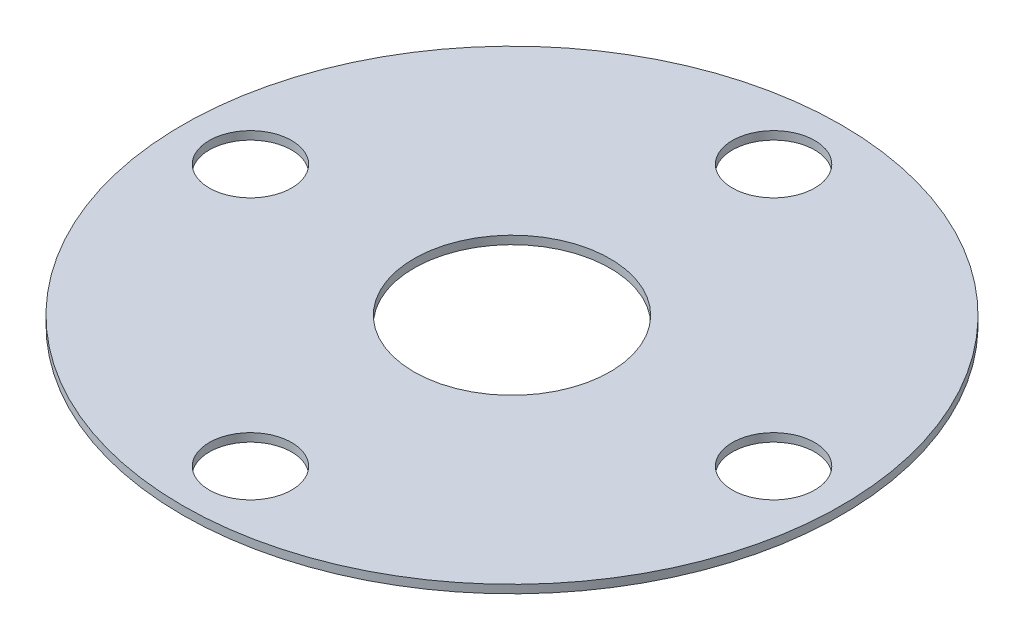
ISO-10303-21;
HEADER;
FILE_DESCRIPTION(('STEP AP214'),'2;1');
FILE_NAME('part.step','',(''),(''),'','','');
FILE_SCHEMA(('AUTOMOTIVE_DESIGN { 1 0 10303 214 1 1 1 1 }'));
ENDSEC;
DATA;
#1=APPLICATION_CONTEXT('core data for automotive mechanical design processes');
#2=APPLICATION_PROTOCOL_DEFINITION('international standard','automotive_design',2000,#1);
#3=PRODUCT_CONTEXT('',#1,'mechanical');
#4=PRODUCT('Part','Part','',(#3));
#5=PRODUCT_RELATED_PRODUCT_CATEGORY('part','',(#4));
#6=PRODUCT_DEFINITION_FORMATION('','',#4);
#7=PRODUCT_DEFINITION_CONTEXT('part definition',#1,'design');
#8=PRODUCT_DEFINITION('design','',#6,#7);
#9=PRODUCT_DEFINITION_SHAPE('','',#8);
#10=(LENGTH_UNIT() NAMED_UNIT(*) SI_UNIT(.MILLI.,.METRE.));
#11=(NAMED_UNIT(*) PLANE_ANGLE_UNIT() SI_UNIT($,.RADIAN.));
#12=(NAMED_UNIT(*) SI_UNIT($,.STERADIAN.) SOLID_ANGLE_UNIT());
#13=UNCERTAINTY_MEASURE_WITH_UNIT(LENGTH_MEASURE(1.E-05),#10,'distance_accuracy_value','');
#14=(GEOMETRIC_REPRESENTATION_CONTEXT(3) GLOBAL_UNCERTAINTY_ASSIGNED_CONTEXT((#13)) GLOBAL_UNIT_ASSIGNED_CONTEXT((#10,
#11,#12)) REPRESENTATION_CONTEXT('',''));
#15=CARTESIAN_POINT('',(0.,0.,0.));
#16=DIRECTION('',(0.,0.,1.));
#17=DIRECTION('',(1.,0.,0.));
#18=AXIS2_PLACEMENT_3D('',#15,#16,#17);
#19=CARTESIAN_POINT('',(0.,0.8,0.));
#20=DIRECTION('',(0.,1.,0.));
#21=DIRECTION('',(0.,0.,1.));
#22=AXIS2_PLACEMENT_3D('',#19,#20,#21);
#23=PLANE('',#22);
#24=CARTESIAN_POINT('',(3.36536354339501E-13,0.8,25.4000000000014));
#25=DIRECTION('',(0.,1.,0.));
#26=DIRECTION('',(0.,0.,1.));
#27=AXIS2_PLACEMENT_3D('',#24,#25,#26);
#28=CIRCLE('',#27,4.);
#29=CARTESIAN_POINT('',(3.36536354339501E-13,0.8,29.4000000000014));
#30=VERTEX_POINT('',#29);
#31=EDGE_CURVE('E72',#30,#30,#28,.T.);
#32=ORIENTED_EDGE('',*,*,#31,.F.);
#33=EDGE_LOOP('',(#32));
#34=FACE_BOUND('',#33,.T.);
#35=CARTESIAN_POINT('',(0.,0.8,-25.4));
#36=DIRECTION('',(0.,1.,0.));
#37=DIRECTION('',(0.,0.,1.));
#38=AXIS2_PLACEMENT_3D('',#35,#36,#37);
#39=CIRCLE('',#38,4.);
#40=CARTESIAN_POINT('',(0.,0.8,-21.4));
#41=VERTEX_POINT('',#40);
#42=EDGE_CURVE('E56',#41,#41,#39,.T.);
#43=ORIENTED_EDGE('',*,*,#42,.F.);
#44=EDGE_LOOP('',(#43));
#45=FACE_BOUND('',#44,.T.);
#46=CARTESIAN_POINT('',(0.,0.8,0.));
#47=DIRECTION('',(0.,1.,0.));
#48=DIRECTION('',(0.,0.,1.));
#49=AXIS2_PLACEMENT_3D('',#46,#47,#48);
#50=CIRCLE('',#49,32.004);
#51=CARTESIAN_POINT('',(0.,0.8,32.004));
#52=VERTEX_POINT('',#51);
#53=EDGE_CURVE('E10',#52,#52,#50,.T.);
#54=ORIENTED_EDGE('',*,*,#53,.T.);
#55=EDGE_LOOP('',(#54));
#56=FACE_BOUND('',#55,.T.);
#57=CARTESIAN_POINT('',(0.,0.8,0.));
#58=DIRECTION('',(0.,1.,0.));
#59=DIRECTION('',(0.,0.,1.));
#60=AXIS2_PLACEMENT_3D('',#57,#58,#59);
#61=CIRCLE('',#60,9.525);
#62=CARTESIAN_POINT('',(0.,0.8,9.525));
#63=VERTEX_POINT('',#62);
#64=EDGE_CURVE('E50',#63,#63,#61,.T.);
#65=ORIENTED_EDGE('',*,*,#64,.F.);
#66=EDGE_LOOP('',(#65));
#67=FACE_BOUND('',#66,.T.);
#68=CARTESIAN_POINT('',(25.4000000000008,0.8,5.13478148889135E-13));
#69=DIRECTION('',(0.,1.,0.));
#70=DIRECTION('',(0.,0.,1.));
#71=AXIS2_PLACEMENT_3D('',#68,#69,#70);
#72=CIRCLE('',#71,4.);
#73=CARTESIAN_POINT('',(25.4000000000008,0.8,4.00000000000051));
#74=VERTEX_POINT('',#73);
#75=EDGE_CURVE('E64',#74,#74,#72,.T.);
#76=ORIENTED_EDGE('',*,*,#75,.F.);
#77=EDGE_LOOP('',(#76));
#78=FACE_BOUND('',#77,.T.);
#79=CARTESIAN_POINT('',(-25.4000000000005,0.8,8.50014503228635E-13));
#80=DIRECTION('',(0.,1.,0.));
#81=DIRECTION('',(0.,0.,1.));
#82=AXIS2_PLACEMENT_3D('',#79,#80,#81);
#83=CIRCLE('',#82,4.);
#84=CARTESIAN_POINT('',(-25.4000000000005,0.8,4.00000000000085));
#85=VERTEX_POINT('',#84);
#86=EDGE_CURVE('E80',#85,#85,#83,.T.);
#87=ORIENTED_EDGE('',*,*,#86,.F.);
#88=EDGE_LOOP('',(#87));
#89=FACE_BOUND('',#88,.T.);
#90=ADVANCED_FACE('F37',(#34,#45,#56,#67,#78,#89),#23,.T.);
#91=CARTESIAN_POINT('',(0.,0.,0.));
#92=DIRECTION('',(0.,1.,0.));
#93=DIRECTION('',(0.,0.,1.));
#94=AXIS2_PLACEMENT_3D('',#91,#92,#93);
#95=PLANE('',#94);
#96=CARTESIAN_POINT('',(0.,0.,0.));
#97=DIRECTION('',(0.,1.,0.));
#98=DIRECTION('',(0.,0.,1.));
#99=AXIS2_PLACEMENT_3D('',#96,#97,#98);
#100=CIRCLE('',#99,32.004);
#101=CARTESIAN_POINT('',(0.,0.,32.004));
#102=VERTEX_POINT('',#101);
#103=EDGE_CURVE('E41',#102,#102,#100,.T.);
#104=ORIENTED_EDGE('',*,*,#103,.F.);
#105=EDGE_LOOP('',(#104));
#106=FACE_BOUND('',#105,.T.);
#107=CARTESIAN_POINT('',(0.,0.,0.));
#108=DIRECTION('',(0.,1.,0.));
#109=DIRECTION('',(0.,0.,1.));
#110=AXIS2_PLACEMENT_3D('',#107,#108,#109);
#111=CIRCLE('',#110,9.525);
#112=CARTESIAN_POINT('',(0.,0.,9.525));
#113=VERTEX_POINT('',#112);
#114=EDGE_CURVE('E52',#113,#113,#111,.T.);
#115=ORIENTED_EDGE('',*,*,#114,.T.);
#116=EDGE_LOOP('',(#115));
#117=FACE_BOUND('',#116,.T.);
#118=CARTESIAN_POINT('',(0.,0.,-25.4));
#119=DIRECTION('',(0.,1.,0.));
#120=DIRECTION('',(0.,0.,1.));
#121=AXIS2_PLACEMENT_3D('',#118,#119,#120);
#122=CIRCLE('',#121,4.);
#123=CARTESIAN_POINT('',(0.,0.,-21.4));
#124=VERTEX_POINT('',#123);
#125=EDGE_CURVE('E60',#124,#124,#122,.T.);
#126=ORIENTED_EDGE('',*,*,#125,.T.);
#127=EDGE_LOOP('',(#126));
#128=FACE_BOUND('',#127,.T.);
#129=CARTESIAN_POINT('',(25.4000000000008,0.,5.13478148889135E-13));
#130=DIRECTION('',(0.,1.,0.));
#131=DIRECTION('',(0.,0.,1.));
#132=AXIS2_PLACEMENT_3D('',#129,#130,#131);
#133=CIRCLE('',#132,4.);
#134=CARTESIAN_POINT('',(25.4000000000008,0.,4.00000000000051));
#135=VERTEX_POINT('',#134);
#136=EDGE_CURVE('E68',#135,#135,#133,.T.);
#137=ORIENTED_EDGE('',*,*,#136,.T.);
#138=EDGE_LOOP('',(#137));
#139=FACE_BOUND('',#138,.T.);
#140=CARTESIAN_POINT('',(3.36536354339501E-13,0.,25.4000000000014));
#141=DIRECTION('',(0.,1.,0.));
#142=DIRECTION('',(0.,0.,1.));
#143=AXIS2_PLACEMENT_3D('',#140,#141,#142);
#144=CIRCLE('',#143,4.);
#145=CARTESIAN_POINT('',(3.36536354339501E-13,0.,29.4000000000014));
#146=VERTEX_POINT('',#145);
#147=EDGE_CURVE('E76',#146,#146,#144,.T.);
#148=ORIENTED_EDGE('',*,*,#147,.T.);
#149=EDGE_LOOP('',(#148));
#150=FACE_BOUND('',#149,.T.);
#151=CARTESIAN_POINT('',(-25.4000000000005,0.,8.50014503228635E-13));
#152=DIRECTION('',(0.,1.,0.));
#153=DIRECTION('',(0.,0.,1.));
#154=AXIS2_PLACEMENT_3D('',#151,#152,#153);
#155=CIRCLE('',#154,4.);
#156=CARTESIAN_POINT('',(-25.4000000000005,0.,4.00000000000085));
#157=VERTEX_POINT('',#156);
#158=EDGE_CURVE('E84',#157,#157,#155,.T.);
#159=ORIENTED_EDGE('',*,*,#158,.T.);
#160=EDGE_LOOP('',(#159));
#161=FACE_BOUND('',#160,.T.);
#162=ADVANCED_FACE('F96',(#106,#117,#128,#139,#150,#161),#95,.F.);
#163=CARTESIAN_POINT('',(0.,0.8,0.));
#164=DIRECTION('',(0.,-1.,0.));
#165=DIRECTION('',(0.,0.,-1.));
#166=AXIS2_PLACEMENT_3D('',#163,#164,#165);
#167=CYLINDRICAL_SURFACE('',#166,32.004);
#168=ORIENTED_EDGE('',*,*,#53,.F.);
#169=EDGE_LOOP('',(#168));
#170=FACE_BOUND('',#169,.T.);
#171=ORIENTED_EDGE('',*,*,#103,.T.);
#172=EDGE_LOOP('',(#171));
#173=FACE_BOUND('',#172,.T.);
#174=ADVANCED_FACE('F39',(#170,#173),#167,.T.);
#175=CARTESIAN_POINT('',(0.,0.8,0.));
#176=DIRECTION('',(0.,-1.,0.));
#177=DIRECTION('',(0.,0.,-1.));
#178=AXIS2_PLACEMENT_3D('',#175,#176,#177);
#179=CYLINDRICAL_SURFACE('',#178,9.525);
#180=ORIENTED_EDGE('',*,*,#64,.T.);
#181=EDGE_LOOP('',(#180));
#182=FACE_BOUND('',#181,.T.);
#183=ORIENTED_EDGE('',*,*,#114,.F.);
#184=EDGE_LOOP('',(#183));
#185=FACE_BOUND('',#184,.T.);
#186=ADVANCED_FACE('F106',(#182,#185),#179,.F.);
#187=CARTESIAN_POINT('',(0.,0.8,-25.4));
#188=DIRECTION('',(0.,-1.,0.));
#189=DIRECTION('',(0.,0.,-1.));
#190=AXIS2_PLACEMENT_3D('',#187,#188,#189);
#191=CYLINDRICAL_SURFACE('',#190,4.);
#192=ORIENTED_EDGE('',*,*,#42,.T.);
#193=EDGE_LOOP('',(#192));
#194=FACE_BOUND('',#193,.T.);
#195=ORIENTED_EDGE('',*,*,#125,.F.);
#196=EDGE_LOOP('',(#195));
#197=FACE_BOUND('',#196,.T.);
#198=ADVANCED_FACE('F109',(#194,#197),#191,.F.);
#199=CARTESIAN_POINT('',(25.4000000000008,0.8,5.13478148889135E-13));
#200=DIRECTION('',(0.,-1.,0.));
#201=DIRECTION('',(0.,0.,-1.));
#202=AXIS2_PLACEMENT_3D('',#199,#200,#201);
#203=CYLINDRICAL_SURFACE('',#202,4.);
#204=ORIENTED_EDGE('',*,*,#75,.T.);
#205=EDGE_LOOP('',(#204));
#206=FACE_BOUND('',#205,.T.);
#207=ORIENTED_EDGE('',*,*,#136,.F.);
#208=EDGE_LOOP('',(#207));
#209=FACE_BOUND('',#208,.T.);
#210=ADVANCED_FACE('F113',(#206,#209),#203,.F.);
#211=CARTESIAN_POINT('',(3.36536354339501E-13,0.8,25.4000000000014));
#212=DIRECTION('',(0.,-1.,0.));
#213=DIRECTION('',(0.,0.,-1.));
#214=AXIS2_PLACEMENT_3D('',#211,#212,#213);
#215=CYLINDRICAL_SURFACE('',#214,4.);
#216=ORIENTED_EDGE('',*,*,#31,.T.);
#217=EDGE_LOOP('',(#216));
#218=FACE_BOUND('',#217,.T.);
#219=ORIENTED_EDGE('',*,*,#147,.F.);
#220=EDGE_LOOP('',(#219));
#221=FACE_BOUND('',#220,.T.);
#222=ADVANCED_FACE('F117',(#218,#221),#215,.F.);
#223=CARTESIAN_POINT('',(-25.4000000000005,0.8,8.50014503228635E-13));
#224=DIRECTION('',(0.,-1.,0.));
#225=DIRECTION('',(0.,0.,-1.));
#226=AXIS2_PLACEMENT_3D('',#223,#224,#225);
#227=CYLINDRICAL_SURFACE('',#226,4.);
#228=ORIENTED_EDGE('',*,*,#86,.T.);
#229=EDGE_LOOP('',(#228));
#230=FACE_BOUND('',#229,.T.);
#231=ORIENTED_EDGE('',*,*,#158,.F.);
#232=EDGE_LOOP('',(#231));
#233=FACE_BOUND('',#232,.T.);
#234=ADVANCED_FACE('F92',(#230,#233),#227,.F.);
#235=CLOSED_SHELL('',(#90,#162,#174,#186,#198,#210,#222,#234));
#236=MANIFOLD_SOLID_BREP('B2',#235);
#237=ADVANCED_BREP_SHAPE_REPRESENTATION('',(#18,#236),#14);
#238=SHAPE_DEFINITION_REPRESENTATION(#9,#237);
ENDSEC;
END-ISO-10303-21;
